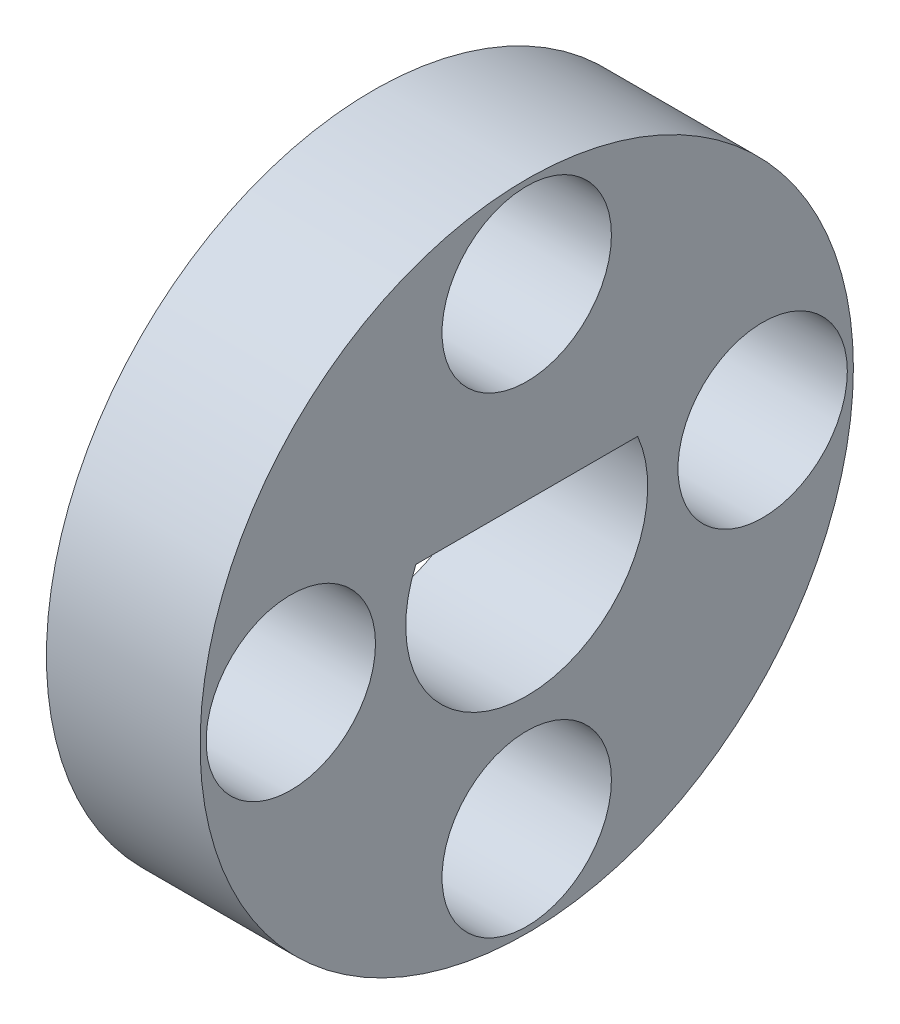
ISO-10303-21;
HEADER;
FILE_DESCRIPTION(('STEP AP214'),'2;1');
FILE_NAME('part.step','',(''),(''),'','','');
FILE_SCHEMA(('AUTOMOTIVE_DESIGN { 1 0 10303 214 1 1 1 1 }'));
ENDSEC;
DATA;
#1=APPLICATION_CONTEXT('core data for automotive mechanical design processes');
#2=APPLICATION_PROTOCOL_DEFINITION('international standard','automotive_design',2000,#1);
#3=PRODUCT_CONTEXT('',#1,'mechanical');
#4=PRODUCT('Part','Part','',(#3));
#5=PRODUCT_RELATED_PRODUCT_CATEGORY('part','',(#4));
#6=PRODUCT_DEFINITION_FORMATION('','',#4);
#7=PRODUCT_DEFINITION_CONTEXT('part definition',#1,'design');
#8=PRODUCT_DEFINITION('design','',#6,#7);
#9=PRODUCT_DEFINITION_SHAPE('','',#8);
#10=(LENGTH_UNIT() NAMED_UNIT(*) SI_UNIT(.MILLI.,.METRE.));
#11=(NAMED_UNIT(*) PLANE_ANGLE_UNIT() SI_UNIT($,.RADIAN.));
#12=(NAMED_UNIT(*) SI_UNIT($,.STERADIAN.) SOLID_ANGLE_UNIT());
#13=UNCERTAINTY_MEASURE_WITH_UNIT(LENGTH_MEASURE(1.E-05),#10,'distance_accuracy_value','');
#14=(GEOMETRIC_REPRESENTATION_CONTEXT(3) GLOBAL_UNCERTAINTY_ASSIGNED_CONTEXT((#13)) GLOBAL_UNIT_ASSIGNED_CONTEXT((#10,
#11,#12)) REPRESENTATION_CONTEXT('',''));
#15=CARTESIAN_POINT('',(0.,0.,0.));
#16=DIRECTION('',(0.,0.,1.));
#17=DIRECTION('',(1.,0.,0.));
#18=AXIS2_PLACEMENT_3D('',#15,#16,#17);
#19=CARTESIAN_POINT('',(6.35,0.,0.));
#20=DIRECTION('',(1.,0.,0.));
#21=DIRECTION('',(0.,0.,-1.));
#22=AXIS2_PLACEMENT_3D('',#19,#20,#21);
#23=PLANE('',#22);
#24=CARTESIAN_POINT('',(6.35,0.,-9.75));
#25=DIRECTION('',(1.,0.,0.));
#26=DIRECTION('',(0.,0.,-1.));
#27=AXIS2_PLACEMENT_3D('',#24,#25,#26);
#28=CIRCLE('',#27,3.5);
#29=CARTESIAN_POINT('',(6.35,0.,-13.25));
#30=VERTEX_POINT('',#29);
#31=EDGE_CURVE('E115',#30,#30,#28,.T.);
#32=ORIENTED_EDGE('',*,*,#31,.F.);
#33=EDGE_LOOP('',(#32));
#34=FACE_BOUND('',#33,.T.);
#35=DIRECTION('',(0.,0.,1.));
#36=VECTOR('',#35,1.);
#37=CARTESIAN_POINT('',(6.35,2.,-4.58257569495584));
#38=LINE('',#37,#36);
#39=CARTESIAN_POINT('',(6.35,2.,-4.58257569495584));
#40=VERTEX_POINT('',#39);
#41=CARTESIAN_POINT('',(6.35,2.,4.58257569495584));
#42=VERTEX_POINT('',#41);
#43=EDGE_CURVE('E84',#40,#42,#38,.T.);
#44=ORIENTED_EDGE('',*,*,#43,.F.);
#45=CARTESIAN_POINT('',(6.35,0.,0.));
#46=DIRECTION('',(1.,0.,0.));
#47=DIRECTION('',(0.,0.,-1.));
#48=AXIS2_PLACEMENT_3D('',#45,#46,#47);
#49=CIRCLE('',#48,5.);
#50=EDGE_CURVE('E69',#42,#40,#49,.T.);
#51=ORIENTED_EDGE('',*,*,#50,.F.);
#52=EDGE_LOOP('',(#44,#51));
#53=FACE_BOUND('',#52,.T.);
#54=CARTESIAN_POINT('',(6.35,0.,9.75));
#55=DIRECTION('',(1.,0.,0.));
#56=DIRECTION('',(0.,0.,-1.));
#57=AXIS2_PLACEMENT_3D('',#54,#55,#56);
#58=CIRCLE('',#57,3.5);
#59=CARTESIAN_POINT('',(6.35,0.,6.25));
#60=VERTEX_POINT('',#59);
#61=EDGE_CURVE('E88',#60,#60,#58,.T.);
#62=ORIENTED_EDGE('',*,*,#61,.F.);
#63=EDGE_LOOP('',(#62));
#64=FACE_BOUND('',#63,.T.);
#65=CARTESIAN_POINT('',(6.35,0.,0.));
#66=DIRECTION('',(1.,0.,0.));
#67=DIRECTION('',(0.,0.,-1.));
#68=AXIS2_PLACEMENT_3D('',#65,#66,#67);
#69=CIRCLE('',#68,13.5);
#70=CARTESIAN_POINT('',(6.35,0.,-13.5));
#71=VERTEX_POINT('',#70);
#72=EDGE_CURVE('E11',#71,#71,#69,.T.);
#73=ORIENTED_EDGE('',*,*,#72,.T.);
#74=EDGE_LOOP('',(#73));
#75=FACE_BOUND('',#74,.T.);
#76=CARTESIAN_POINT('',(6.35,9.75,0.));
#77=DIRECTION('',(1.,0.,0.));
#78=DIRECTION('',(0.,0.,-1.));
#79=AXIS2_PLACEMENT_3D('',#76,#77,#78);
#80=CIRCLE('',#79,3.50000000000001);
#81=CARTESIAN_POINT('',(6.35,9.75,-3.50000000000001));
#82=VERTEX_POINT('',#81);
#83=EDGE_CURVE('E78',#82,#82,#80,.T.);
#84=ORIENTED_EDGE('',*,*,#83,.F.);
#85=EDGE_LOOP('',(#84));
#86=FACE_BOUND('',#85,.T.);
#87=CARTESIAN_POINT('',(6.35,-9.75,0.));
#88=DIRECTION('',(1.,0.,0.));
#89=DIRECTION('',(0.,0.,-1.));
#90=AXIS2_PLACEMENT_3D('',#87,#88,#89);
#91=CIRCLE('',#90,3.50000000000003);
#92=CARTESIAN_POINT('',(6.35,-9.75,-3.50000000000003));
#93=VERTEX_POINT('',#92);
#94=EDGE_CURVE('E125',#93,#93,#91,.T.);
#95=ORIENTED_EDGE('',*,*,#94,.F.);
#96=EDGE_LOOP('',(#95));
#97=FACE_BOUND('',#96,.T.);
#98=ADVANCED_FACE('F37',(#34,#53,#64,#75,#86,#97),#23,.T.);
#99=CARTESIAN_POINT('',(0.,0.,0.));
#100=DIRECTION('',(1.,0.,0.));
#101=DIRECTION('',(0.,0.,-1.));
#102=AXIS2_PLACEMENT_3D('',#99,#100,#101);
#103=PLANE('',#102);
#104=CARTESIAN_POINT('',(0.,0.,9.75));
#105=DIRECTION('',(1.,0.,0.));
#106=DIRECTION('',(0.,0.,-1.));
#107=AXIS2_PLACEMENT_3D('',#104,#105,#106);
#108=CIRCLE('',#107,3.5);
#109=CARTESIAN_POINT('',(0.,0.,6.25));
#110=VERTEX_POINT('',#109);
#111=EDGE_CURVE('E74',#110,#110,#108,.T.);
#112=ORIENTED_EDGE('',*,*,#111,.T.);
#113=EDGE_LOOP('',(#112));
#114=FACE_BOUND('',#113,.T.);
#115=CARTESIAN_POINT('',(0.,0.,0.));
#116=DIRECTION('',(1.,0.,0.));
#117=DIRECTION('',(0.,0.,-1.));
#118=AXIS2_PLACEMENT_3D('',#115,#116,#117);
#119=CIRCLE('',#118,13.5);
#120=CARTESIAN_POINT('',(0.,0.,-13.5));
#121=VERTEX_POINT('',#120);
#122=EDGE_CURVE('E41',#121,#121,#119,.T.);
#123=ORIENTED_EDGE('',*,*,#122,.F.);
#124=EDGE_LOOP('',(#123));
#125=FACE_BOUND('',#124,.T.);
#126=CARTESIAN_POINT('',(0.,0.,0.));
#127=DIRECTION('',(1.,0.,0.));
#128=DIRECTION('',(0.,0.,-1.));
#129=AXIS2_PLACEMENT_3D('',#126,#127,#128);
#130=CIRCLE('',#129,5.);
#131=CARTESIAN_POINT('',(0.,2.,4.58257569495584));
#132=VERTEX_POINT('',#131);
#133=CARTESIAN_POINT('',(0.,2.,-4.58257569495584));
#134=VERTEX_POINT('',#133);
#135=EDGE_CURVE('E59',#132,#134,#130,.T.);
#136=ORIENTED_EDGE('',*,*,#135,.T.);
#137=DIRECTION('',(0.,0.,1.));
#138=VECTOR('',#137,1.);
#139=CARTESIAN_POINT('',(0.,2.,-4.58257569495584));
#140=LINE('',#139,#138);
#141=EDGE_CURVE('E65',#134,#132,#140,.T.);
#142=ORIENTED_EDGE('',*,*,#141,.T.);
#143=EDGE_LOOP('',(#136,#142));
#144=FACE_BOUND('',#143,.T.);
#145=CARTESIAN_POINT('',(0.,9.75,0.));
#146=DIRECTION('',(1.,0.,0.));
#147=DIRECTION('',(0.,0.,-1.));
#148=AXIS2_PLACEMENT_3D('',#145,#146,#147);
#149=CIRCLE('',#148,3.50000000000001);
#150=CARTESIAN_POINT('',(0.,9.75,-3.50000000000001));
#151=VERTEX_POINT('',#150);
#152=EDGE_CURVE('E81',#151,#151,#149,.T.);
#153=ORIENTED_EDGE('',*,*,#152,.T.);
#154=EDGE_LOOP('',(#153));
#155=FACE_BOUND('',#154,.T.);
#156=CARTESIAN_POINT('',(0.,0.,-9.75));
#157=DIRECTION('',(1.,0.,0.));
#158=DIRECTION('',(0.,0.,-1.));
#159=AXIS2_PLACEMENT_3D('',#156,#157,#158);
#160=CIRCLE('',#159,3.5);
#161=CARTESIAN_POINT('',(0.,0.,-13.25));
#162=VERTEX_POINT('',#161);
#163=EDGE_CURVE('E127',#162,#162,#160,.T.);
#164=ORIENTED_EDGE('',*,*,#163,.T.);
#165=EDGE_LOOP('',(#164));
#166=FACE_BOUND('',#165,.T.);
#167=CARTESIAN_POINT('',(0.,-9.75,0.));
#168=DIRECTION('',(1.,0.,0.));
#169=DIRECTION('',(0.,0.,-1.));
#170=AXIS2_PLACEMENT_3D('',#167,#168,#169);
#171=CIRCLE('',#170,3.50000000000003);
#172=CARTESIAN_POINT('',(0.,-9.75,-3.50000000000003));
#173=VERTEX_POINT('',#172);
#174=EDGE_CURVE('E128',#173,#173,#171,.T.);
#175=ORIENTED_EDGE('',*,*,#174,.T.);
#176=EDGE_LOOP('',(#175));
#177=FACE_BOUND('',#176,.T.);
#178=ADVANCED_FACE('F76',(#114,#125,#144,#155,#166,#177),#103,.F.);
#179=CARTESIAN_POINT('',(6.35,0.,0.));
#180=DIRECTION('',(-1.,0.,0.));
#181=DIRECTION('',(0.,0.,1.));
#182=AXIS2_PLACEMENT_3D('',#179,#180,#181);
#183=CYLINDRICAL_SURFACE('',#182,13.5);
#184=ORIENTED_EDGE('',*,*,#72,.F.);
#185=EDGE_LOOP('',(#184));
#186=FACE_BOUND('',#185,.T.);
#187=ORIENTED_EDGE('',*,*,#122,.T.);
#188=EDGE_LOOP('',(#187));
#189=FACE_BOUND('',#188,.T.);
#190=ADVANCED_FACE('F39',(#186,#189),#183,.T.);
#191=CARTESIAN_POINT('',(6.35,0.,9.75));
#192=DIRECTION('',(-1.,0.,0.));
#193=DIRECTION('',(0.,0.,1.));
#194=AXIS2_PLACEMENT_3D('',#191,#192,#193);
#195=CYLINDRICAL_SURFACE('',#194,3.5);
#196=ORIENTED_EDGE('',*,*,#61,.T.);
#197=EDGE_LOOP('',(#196));
#198=FACE_BOUND('',#197,.T.);
#199=ORIENTED_EDGE('',*,*,#111,.F.);
#200=EDGE_LOOP('',(#199));
#201=FACE_BOUND('',#200,.T.);
#202=ADVANCED_FACE('F96',(#198,#201),#195,.F.);
#203=CARTESIAN_POINT('',(6.35,0.,0.));
#204=DIRECTION('',(-1.,0.,0.));
#205=DIRECTION('',(0.,0.,1.));
#206=AXIS2_PLACEMENT_3D('',#203,#204,#205);
#207=CYLINDRICAL_SURFACE('',#206,5.);
#208=ORIENTED_EDGE('',*,*,#135,.F.);
#209=DIRECTION('',(-1.,0.,0.));
#210=VECTOR('',#209,1.);
#211=CARTESIAN_POINT('',(6.35,2.,4.58257569495584));
#212=LINE('',#211,#210);
#213=EDGE_CURVE('E67',#42,#132,#212,.T.);
#214=ORIENTED_EDGE('',*,*,#213,.F.);
#215=ORIENTED_EDGE('',*,*,#50,.T.);
#216=DIRECTION('',(-1.,0.,0.));
#217=VECTOR('',#216,1.);
#218=CARTESIAN_POINT('',(6.35,2.,-4.58257569495584));
#219=LINE('',#218,#217);
#220=EDGE_CURVE('E52',#40,#134,#219,.T.);
#221=ORIENTED_EDGE('',*,*,#220,.T.);
#222=EDGE_LOOP('',(#208,#214,#215,#221));
#223=FACE_BOUND('',#222,.T.);
#224=ADVANCED_FACE('F71',(#223),#207,.F.);
#225=CARTESIAN_POINT('',(6.35,2.,-4.58257569495584));
#226=DIRECTION('',(0.,-1.,0.));
#227=DIRECTION('',(0.,0.,-1.));
#228=AXIS2_PLACEMENT_3D('',#225,#226,#227);
#229=PLANE('',#228);
#230=ORIENTED_EDGE('',*,*,#141,.F.);
#231=ORIENTED_EDGE('',*,*,#220,.F.);
#232=ORIENTED_EDGE('',*,*,#43,.T.);
#233=ORIENTED_EDGE('',*,*,#213,.T.);
#234=EDGE_LOOP('',(#230,#231,#232,#233));
#235=FACE_BOUND('',#234,.T.);
#236=ADVANCED_FACE('F66',(#235),#229,.T.);
#237=CARTESIAN_POINT('',(6.35,9.75,0.));
#238=DIRECTION('',(-1.,0.,0.));
#239=DIRECTION('',(0.,0.,1.));
#240=AXIS2_PLACEMENT_3D('',#237,#238,#239);
#241=CYLINDRICAL_SURFACE('',#240,3.50000000000001);
#242=ORIENTED_EDGE('',*,*,#83,.T.);
#243=EDGE_LOOP('',(#242));
#244=FACE_BOUND('',#243,.T.);
#245=ORIENTED_EDGE('',*,*,#152,.F.);
#246=EDGE_LOOP('',(#245));
#247=FACE_BOUND('',#246,.T.);
#248=ADVANCED_FACE('F140',(#244,#247),#241,.F.);
#249=CARTESIAN_POINT('',(6.35,0.,-9.75));
#250=DIRECTION('',(-1.,0.,0.));
#251=DIRECTION('',(0.,0.,1.));
#252=AXIS2_PLACEMENT_3D('',#249,#250,#251);
#253=CYLINDRICAL_SURFACE('',#252,3.5);
#254=ORIENTED_EDGE('',*,*,#31,.T.);
#255=EDGE_LOOP('',(#254));
#256=FACE_BOUND('',#255,.T.);
#257=ORIENTED_EDGE('',*,*,#163,.F.);
#258=EDGE_LOOP('',(#257));
#259=FACE_BOUND('',#258,.T.);
#260=ADVANCED_FACE('F142',(#256,#259),#253,.F.);
#261=CARTESIAN_POINT('',(6.35,-9.75,0.));
#262=DIRECTION('',(-1.,0.,0.));
#263=DIRECTION('',(0.,0.,1.));
#264=AXIS2_PLACEMENT_3D('',#261,#262,#263);
#265=CYLINDRICAL_SURFACE('',#264,3.50000000000003);
#266=ORIENTED_EDGE('',*,*,#94,.T.);
#267=EDGE_LOOP('',(#266));
#268=FACE_BOUND('',#267,.T.);
#269=ORIENTED_EDGE('',*,*,#174,.F.);
#270=EDGE_LOOP('',(#269));
#271=FACE_BOUND('',#270,.T.);
#272=ADVANCED_FACE('F149',(#268,#271),#265,.F.);
#273=CLOSED_SHELL('',(#98,#178,#190,#202,#224,#236,#248,#260,#272));
#274=MANIFOLD_SOLID_BREP('B2',#273);
#275=ADVANCED_BREP_SHAPE_REPRESENTATION('',(#18,#274),#14);
#276=SHAPE_DEFINITION_REPRESENTATION(#9,#275);
ENDSEC;
END-ISO-10303-21;
